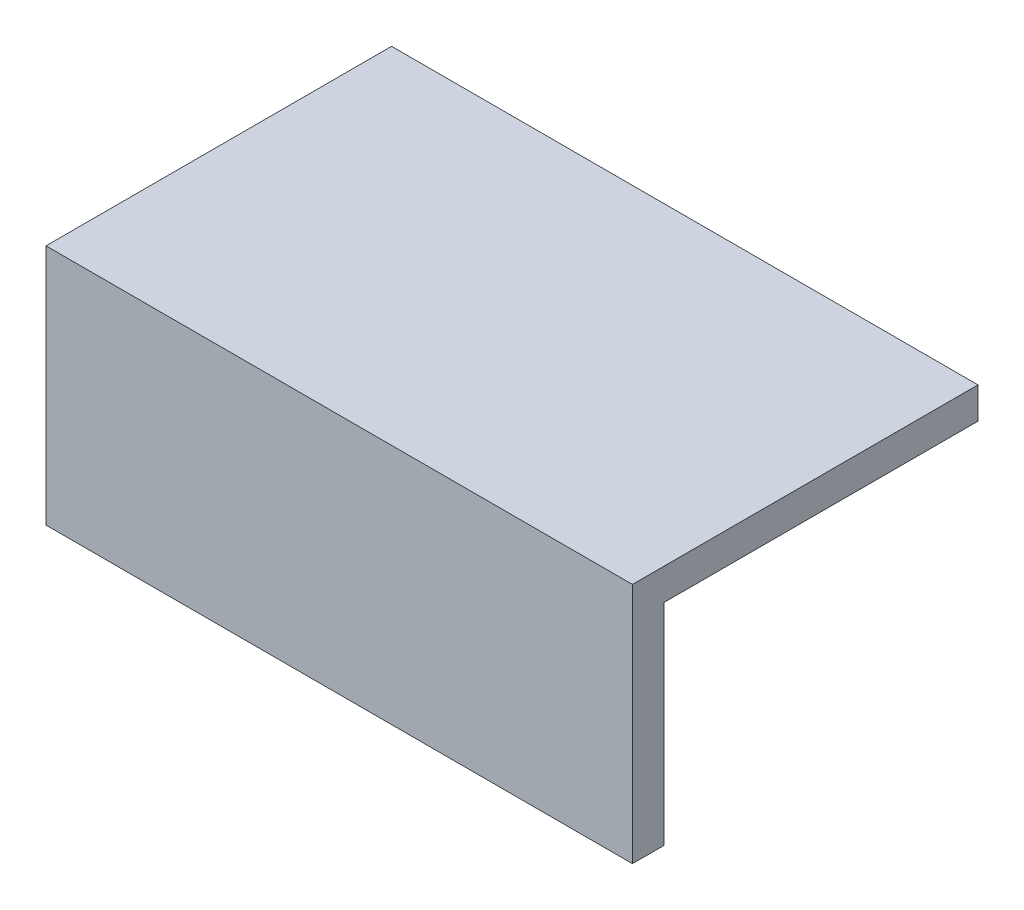
ISO-10303-21;
HEADER;
FILE_DESCRIPTION(('STEP AP214'),'2;1');
FILE_NAME('part.step','',(''),(''),'','','');
FILE_SCHEMA(('AUTOMOTIVE_DESIGN { 1 0 10303 214 1 1 1 1 }'));
ENDSEC;
DATA;
#1=APPLICATION_CONTEXT('core data for automotive mechanical design processes');
#2=APPLICATION_PROTOCOL_DEFINITION('international standard','automotive_design',2000,#1);
#3=PRODUCT_CONTEXT('',#1,'mechanical');
#4=PRODUCT('Part','Part','',(#3));
#5=PRODUCT_RELATED_PRODUCT_CATEGORY('part','',(#4));
#6=PRODUCT_DEFINITION_FORMATION('','',#4);
#7=PRODUCT_DEFINITION_CONTEXT('part definition',#1,'design');
#8=PRODUCT_DEFINITION('design','',#6,#7);
#9=PRODUCT_DEFINITION_SHAPE('','',#8);
#10=(LENGTH_UNIT() NAMED_UNIT(*) SI_UNIT(.MILLI.,.METRE.));
#11=(NAMED_UNIT(*) PLANE_ANGLE_UNIT() SI_UNIT($,.RADIAN.));
#12=(NAMED_UNIT(*) SI_UNIT($,.STERADIAN.) SOLID_ANGLE_UNIT());
#13=UNCERTAINTY_MEASURE_WITH_UNIT(LENGTH_MEASURE(1.E-05),#10,'distance_accuracy_value','');
#14=(GEOMETRIC_REPRESENTATION_CONTEXT(3) GLOBAL_UNCERTAINTY_ASSIGNED_CONTEXT((#13)) GLOBAL_UNIT_ASSIGNED_CONTEXT((#10,
#11,#12)) REPRESENTATION_CONTEXT('',''));
#15=CARTESIAN_POINT('',(0.,0.,0.));
#16=DIRECTION('',(0.,0.,1.));
#17=DIRECTION('',(1.,0.,0.));
#18=AXIS2_PLACEMENT_3D('',#15,#16,#17);
#19=CARTESIAN_POINT('',(-27.2,0.,30.));
#20=DIRECTION('',(-1.,0.,0.));
#21=DIRECTION('',(0.,0.,1.));
#22=AXIS2_PLACEMENT_3D('',#19,#20,#21);
#23=PLANE('',#22);
#24=DIRECTION('',(0.,-1.,0.));
#25=VECTOR('',#24,1.);
#26=CARTESIAN_POINT('',(-27.2,0.,20.));
#27=LINE('',#26,#25);
#28=CARTESIAN_POINT('',(-27.2,31.2967297963401,20.));
#29=VERTEX_POINT('',#28);
#30=CARTESIAN_POINT('',(-27.2,25.,20.));
#31=VERTEX_POINT('',#30);
#32=EDGE_CURVE('E202',#29,#31,#27,.T.);
#33=ORIENTED_EDGE('',*,*,#32,.F.);
#34=DIRECTION('',(0.,0.,-1.));
#35=VECTOR('',#34,1.);
#36=CARTESIAN_POINT('',(-27.2,31.2967297963401,30.));
#37=LINE('',#36,#35);
#38=CARTESIAN_POINT('',(-27.2,31.2967297963401,24.));
#39=VERTEX_POINT('',#38);
#40=EDGE_CURVE('E334',#29,#39,#37,.F.);
#41=ORIENTED_EDGE('',*,*,#40,.T.);
#42=DIRECTION('',(0.,1.,0.));
#43=VECTOR('',#42,1.);
#44=CARTESIAN_POINT('',(-27.2,0.,24.));
#45=LINE('',#44,#43);
#46=CARTESIAN_POINT('',(-27.2,45.09672979634,24.));
#47=VERTEX_POINT('',#46);
#48=EDGE_CURVE('E288',#39,#47,#45,.T.);
#49=ORIENTED_EDGE('',*,*,#48,.T.);
#50=DIRECTION('',(0.,0.,-1.));
#51=VECTOR('',#50,1.);
#52=CARTESIAN_POINT('',(-27.2,45.09672979634,30.));
#53=LINE('',#52,#51);
#54=CARTESIAN_POINT('',(-27.2,45.09672979634,30.));
#55=VERTEX_POINT('',#54);
#56=EDGE_CURVE('E313',#55,#47,#53,.T.);
#57=ORIENTED_EDGE('',*,*,#56,.F.);
#58=DIRECTION('',(0.,1.,0.));
#59=VECTOR('',#58,1.);
#60=CARTESIAN_POINT('',(-27.2,0.,30.));
#61=LINE('',#60,#59);
#62=CARTESIAN_POINT('',(-27.2,25.,30.));
#63=VERTEX_POINT('',#62);
#64=EDGE_CURVE('E295',#63,#55,#61,.T.);
#65=ORIENTED_EDGE('',*,*,#64,.F.);
#66=DIRECTION('',(0.,0.,-1.));
#67=VECTOR('',#66,1.);
#68=CARTESIAN_POINT('',(-27.2,25.,30.));
#69=LINE('',#68,#67);
#70=EDGE_CURVE('E316',#63,#31,#69,.T.);
#71=ORIENTED_EDGE('',*,*,#70,.T.);
#72=EDGE_LOOP('',(#33,#41,#49,#57,#65,#71));
#73=FACE_BOUND('',#72,.T.);
#74=ADVANCED_FACE('F37',(#73),#23,.F.);
#75=CARTESIAN_POINT('',(0.,45.09672979634,30.));
#76=DIRECTION('',(0.,1.,0.));
#77=DIRECTION('',(0.,0.,1.));
#78=AXIS2_PLACEMENT_3D('',#75,#76,#77);
#79=PLANE('',#78);
#80=DIRECTION('',(0.,0.,-1.));
#81=VECTOR('',#80,1.);
#82=CARTESIAN_POINT('',(-4.6329584769427,45.09672979634,30.));
#83=LINE('',#82,#81);
#84=CARTESIAN_POINT('',(-4.6329584769427,45.09672979634,24.));
#85=VERTEX_POINT('',#84);
#86=CARTESIAN_POINT('',(-4.6329584769427,45.09672979634,20.));
#87=VERTEX_POINT('',#86);
#88=EDGE_CURVE('E337',#85,#87,#83,.T.);
#89=ORIENTED_EDGE('',*,*,#88,.T.);
#90=DIRECTION('',(1.,0.,0.));
#91=VECTOR('',#90,1.);
#92=CARTESIAN_POINT('',(0.,45.09672979634,20.));
#93=LINE('',#92,#91);
#94=CARTESIAN_POINT('',(-27.2,45.09672979634,20.));
#95=VERTEX_POINT('',#94);
#96=EDGE_CURVE('E276',#95,#87,#93,.T.);
#97=ORIENTED_EDGE('',*,*,#96,.F.);
#98=CARTESIAN_POINT('',(-27.2,45.09672979634,0.));
#99=VERTEX_POINT('',#98);
#100=EDGE_CURVE('E299',#95,#99,#53,.T.);
#101=ORIENTED_EDGE('',*,*,#100,.T.);
#102=DIRECTION('',(1.,0.,0.));
#103=VECTOR('',#102,1.);
#104=CARTESIAN_POINT('',(0.,45.09672979634,0.));
#105=LINE('',#104,#103);
#106=CARTESIAN_POINT('',(28.,45.09672979634,0.));
#107=VERTEX_POINT('',#106);
#108=EDGE_CURVE('E291',#99,#107,#105,.T.);
#109=ORIENTED_EDGE('',*,*,#108,.T.);
#110=DIRECTION('',(0.,0.,-1.));
#111=VECTOR('',#110,1.);
#112=CARTESIAN_POINT('',(28.,45.09672979634,30.));
#113=LINE('',#112,#111);
#114=CARTESIAN_POINT('',(28.,45.09672979634,30.));
#115=VERTEX_POINT('',#114);
#116=EDGE_CURVE('E324',#115,#107,#113,.T.);
#117=ORIENTED_EDGE('',*,*,#116,.F.);
#118=DIRECTION('',(1.,0.,0.));
#119=VECTOR('',#118,1.);
#120=CARTESIAN_POINT('',(0.,45.09672979634,30.));
#121=LINE('',#120,#119);
#122=EDGE_CURVE('E292',#55,#115,#121,.T.);
#123=ORIENTED_EDGE('',*,*,#122,.F.);
#124=ORIENTED_EDGE('',*,*,#56,.T.);
#125=DIRECTION('',(1.,0.,0.));
#126=VECTOR('',#125,1.);
#127=CARTESIAN_POINT('',(0.,45.09672979634,24.));
#128=LINE('',#127,#126);
#129=EDGE_CURVE('E235',#47,#85,#128,.T.);
#130=ORIENTED_EDGE('',*,*,#129,.T.);
#131=EDGE_LOOP('',(#89,#97,#101,#109,#117,#123,#124,#130));
#132=FACE_BOUND('',#131,.T.);
#133=ADVANCED_FACE('F387',(#132),#79,.F.);
#134=DIRECTION('',(0.,1.,0.));
#135=VECTOR('',#134,1.);
#136=CARTESIAN_POINT('',(-27.2,0.,20.));
#137=LINE('',#136,#135);
#138=CARTESIAN_POINT('',(-27.2,38.0223724406594,20.));
#139=VERTEX_POINT('',#138);
#140=EDGE_CURVE('E278',#139,#95,#137,.T.);
#141=ORIENTED_EDGE('',*,*,#140,.F.);
#142=DIRECTION('',(0.,0.,-1.));
#143=VECTOR('',#142,1.);
#144=CARTESIAN_POINT('',(-27.2,38.0223724406594,33.2068991055148));
#145=LINE('',#144,#143);
#146=CARTESIAN_POINT('',(-27.2,38.0223724406594,0.));
#147=VERTEX_POINT('',#146);
#148=EDGE_CURVE('E205',#139,#147,#145,.T.);
#149=ORIENTED_EDGE('',*,*,#148,.T.);
#150=DIRECTION('',(0.,1.,0.));
#151=VECTOR('',#150,1.);
#152=CARTESIAN_POINT('',(-27.2,0.,0.));
#153=LINE('',#152,#151);
#154=EDGE_CURVE('E296',#147,#99,#153,.T.);
#155=ORIENTED_EDGE('',*,*,#154,.T.);
#156=ORIENTED_EDGE('',*,*,#100,.F.);
#157=EDGE_LOOP('',(#141,#149,#155,#156));
#158=FACE_BOUND('',#157,.T.);
#159=ADVANCED_FACE('F384',(#158),#23,.F.);
#160=CARTESIAN_POINT('',(28.,0.,30.));
#161=DIRECTION('',(-1.,0.,0.));
#162=DIRECTION('',(0.,0.,1.));
#163=AXIS2_PLACEMENT_3D('',#160,#161,#162);
#164=PLANE('',#163);
#165=DIRECTION('',(0.,1.,0.));
#166=VECTOR('',#165,1.);
#167=CARTESIAN_POINT('',(28.,0.,0.));
#168=LINE('',#167,#166);
#169=CARTESIAN_POINT('',(28.,48.0967297963401,0.));
#170=VERTEX_POINT('',#169);
#171=EDGE_CURVE('E302',#107,#170,#168,.T.);
#172=ORIENTED_EDGE('',*,*,#171,.T.);
#173=DIRECTION('',(0.,0.,-1.));
#174=VECTOR('',#173,1.);
#175=CARTESIAN_POINT('',(28.,48.0967297963401,30.));
#176=LINE('',#175,#174);
#177=CARTESIAN_POINT('',(28.,48.0967297963401,33.));
#178=VERTEX_POINT('',#177);
#179=EDGE_CURVE('E322',#178,#170,#176,.T.);
#180=ORIENTED_EDGE('',*,*,#179,.F.);
#181=DIRECTION('',(0.,1.,0.));
#182=VECTOR('',#181,1.);
#183=CARTESIAN_POINT('',(28.,48.0967297963401,33.));
#184=LINE('',#183,#182);
#185=CARTESIAN_POINT('',(28.,25.,33.));
#186=VERTEX_POINT('',#185);
#187=EDGE_CURVE('E223',#186,#178,#184,.T.);
#188=ORIENTED_EDGE('',*,*,#187,.F.);
#189=DIRECTION('',(0.,0.,-1.));
#190=VECTOR('',#189,1.);
#191=CARTESIAN_POINT('',(28.,25.,33.));
#192=LINE('',#191,#190);
#193=CARTESIAN_POINT('',(28.,25.,30.));
#194=VERTEX_POINT('',#193);
#195=EDGE_CURVE('E229',#186,#194,#192,.T.);
#196=ORIENTED_EDGE('',*,*,#195,.T.);
#197=DIRECTION('',(0.,1.,0.));
#198=VECTOR('',#197,1.);
#199=CARTESIAN_POINT('',(28.,48.0967297963401,30.));
#200=LINE('',#199,#198);
#201=EDGE_CURVE('E221',#194,#115,#200,.T.);
#202=ORIENTED_EDGE('',*,*,#201,.T.);
#203=ORIENTED_EDGE('',*,*,#116,.T.);
#204=EDGE_LOOP('',(#172,#180,#188,#196,#202,#203));
#205=FACE_BOUND('',#204,.T.);
#206=ADVANCED_FACE('F390',(#205),#164,.F.);
#207=CARTESIAN_POINT('',(0.,48.0967297963401,30.));
#208=DIRECTION('',(0.,1.,0.));
#209=DIRECTION('',(0.,0.,1.));
#210=AXIS2_PLACEMENT_3D('',#207,#208,#209);
#211=PLANE('',#210);
#212=DIRECTION('',(1.,0.,0.));
#213=VECTOR('',#212,1.);
#214=CARTESIAN_POINT('',(0.,48.0967297963401,0.));
#215=LINE('',#214,#213);
#216=CARTESIAN_POINT('',(-28.,48.0967297963401,0.));
#217=VERTEX_POINT('',#216);
#218=EDGE_CURVE('E305',#217,#170,#215,.T.);
#219=ORIENTED_EDGE('',*,*,#218,.F.);
#220=DIRECTION('',(0.,0.,-1.));
#221=VECTOR('',#220,1.);
#222=CARTESIAN_POINT('',(-28.,48.0967297963401,30.));
#223=LINE('',#222,#221);
#224=CARTESIAN_POINT('',(-28.,48.0967297963401,33.));
#225=VERTEX_POINT('',#224);
#226=EDGE_CURVE('E320',#225,#217,#223,.T.);
#227=ORIENTED_EDGE('',*,*,#226,.F.);
#228=DIRECTION('',(-1.,0.,0.));
#229=VECTOR('',#228,1.);
#230=CARTESIAN_POINT('',(-28.,48.0967297963401,33.));
#231=LINE('',#230,#229);
#232=EDGE_CURVE('E226',#178,#225,#231,.T.);
#233=ORIENTED_EDGE('',*,*,#232,.F.);
#234=ORIENTED_EDGE('',*,*,#179,.T.);
#235=EDGE_LOOP('',(#219,#227,#233,#234));
#236=FACE_BOUND('',#235,.T.);
#237=ADVANCED_FACE('F420',(#236),#211,.T.);
#238=CARTESIAN_POINT('',(-28.,0.,30.));
#239=DIRECTION('',(-1.,0.,0.));
#240=DIRECTION('',(0.,0.,1.));
#241=AXIS2_PLACEMENT_3D('',#238,#239,#240);
#242=PLANE('',#241);
#243=DIRECTION('',(0.,1.,0.));
#244=VECTOR('',#243,1.);
#245=CARTESIAN_POINT('',(-28.,0.,0.));
#246=LINE('',#245,#244);
#247=CARTESIAN_POINT('',(-28.,25.,0.));
#248=VERTEX_POINT('',#247);
#249=EDGE_CURVE('E308',#248,#217,#246,.T.);
#250=ORIENTED_EDGE('',*,*,#249,.F.);
#251=DIRECTION('',(0.,0.,-1.));
#252=VECTOR('',#251,1.);
#253=CARTESIAN_POINT('',(-28.,25.,30.));
#254=LINE('',#253,#252);
#255=CARTESIAN_POINT('',(-28.,25.,33.));
#256=VERTEX_POINT('',#255);
#257=EDGE_CURVE('E318',#256,#248,#254,.T.);
#258=ORIENTED_EDGE('',*,*,#257,.F.);
#259=DIRECTION('',(0.,-1.,0.));
#260=VECTOR('',#259,1.);
#261=CARTESIAN_POINT('',(-28.,48.0967297963401,33.));
#262=LINE('',#261,#260);
#263=EDGE_CURVE('E217',#225,#256,#262,.T.);
#264=ORIENTED_EDGE('',*,*,#263,.F.);
#265=ORIENTED_EDGE('',*,*,#226,.T.);
#266=EDGE_LOOP('',(#250,#258,#264,#265));
#267=FACE_BOUND('',#266,.T.);
#268=ADVANCED_FACE('F425',(#267),#242,.T.);
#269=CARTESIAN_POINT('',(0.,25.,30.));
#270=DIRECTION('',(0.,1.,0.));
#271=DIRECTION('',(0.,0.,1.));
#272=AXIS2_PLACEMENT_3D('',#269,#270,#271);
#273=PLANE('',#272);
#274=DIRECTION('',(1.,0.,0.));
#275=VECTOR('',#274,1.);
#276=CARTESIAN_POINT('',(0.,25.,0.));
#277=LINE('',#276,#275);
#278=CARTESIAN_POINT('',(-25.,25.,0.));
#279=VERTEX_POINT('',#278);
#280=EDGE_CURVE('E209',#248,#279,#277,.T.);
#281=ORIENTED_EDGE('',*,*,#280,.T.);
#282=DIRECTION('',(0.,0.,-1.));
#283=VECTOR('',#282,1.);
#284=CARTESIAN_POINT('',(-25.,25.,33.2068991055148));
#285=LINE('',#284,#283);
#286=CARTESIAN_POINT('',(-25.,25.,20.));
#287=VERTEX_POINT('',#286);
#288=EDGE_CURVE('E191',#287,#279,#285,.T.);
#289=ORIENTED_EDGE('',*,*,#288,.F.);
#290=DIRECTION('',(-1.,0.,0.));
#291=VECTOR('',#290,1.);
#292=CARTESIAN_POINT('',(0.,25.,20.));
#293=LINE('',#292,#291);
#294=EDGE_CURVE('E199',#287,#31,#293,.T.);
#295=ORIENTED_EDGE('',*,*,#294,.T.);
#296=ORIENTED_EDGE('',*,*,#70,.F.);
#297=DIRECTION('',(1.,0.,0.));
#298=VECTOR('',#297,1.);
#299=CARTESIAN_POINT('',(-28.,25.,30.));
#300=LINE('',#299,#298);
#301=EDGE_CURVE('E215',#63,#194,#300,.T.);
#302=ORIENTED_EDGE('',*,*,#301,.T.);
#303=ORIENTED_EDGE('',*,*,#195,.F.);
#304=DIRECTION('',(1.,0.,0.));
#305=VECTOR('',#304,1.);
#306=CARTESIAN_POINT('',(-28.,25.,33.));
#307=LINE('',#306,#305);
#308=EDGE_CURVE('E220',#256,#186,#307,.T.);
#309=ORIENTED_EDGE('',*,*,#308,.F.);
#310=ORIENTED_EDGE('',*,*,#257,.T.);
#311=EDGE_LOOP('',(#281,#289,#295,#296,#302,#303,#309,#310));
#312=FACE_BOUND('',#311,.T.);
#313=ADVANCED_FACE('F207',(#312),#273,.F.);
#314=CARTESIAN_POINT('',(0.,0.,0.));
#315=DIRECTION('',(0.,0.,1.));
#316=DIRECTION('',(1.,0.,0.));
#317=AXIS2_PLACEMENT_3D('',#314,#315,#316);
#318=PLANE('',#317);
#319=ORIENTED_EDGE('',*,*,#108,.F.);
#320=ORIENTED_EDGE('',*,*,#154,.F.);
#321=DIRECTION('',(0.372038204686062,-0.928217417555807,0.));
#322=VECTOR('',#321,1.);
#323=CARTESIAN_POINT('',(-10.3048271121279,-4.13027088900303,0.));
#324=LINE('',#323,#322);
#325=CARTESIAN_POINT('',(-25.,32.5334783085475,0.));
#326=VERTEX_POINT('',#325);
#327=EDGE_CURVE('E363',#147,#326,#324,.T.);
#328=ORIENTED_EDGE('',*,*,#327,.T.);
#329=DIRECTION('',(0.,-1.,0.));
#330=VECTOR('',#329,1.);
#331=CARTESIAN_POINT('',(-25.,0.,0.));
#332=LINE('',#331,#330);
#333=EDGE_CURVE('E196',#326,#279,#332,.T.);
#334=ORIENTED_EDGE('',*,*,#333,.T.);
#335=ORIENTED_EDGE('',*,*,#280,.F.);
#336=ORIENTED_EDGE('',*,*,#249,.T.);
#337=ORIENTED_EDGE('',*,*,#218,.T.);
#338=ORIENTED_EDGE('',*,*,#171,.F.);
#339=EDGE_LOOP('',(#319,#320,#328,#334,#335,#336,#337,#338));
#340=FACE_BOUND('',#339,.T.);
#341=ADVANCED_FACE('F372',(#340),#318,.F.);
#342=CARTESIAN_POINT('',(-28.,35.7967297963401,52.0794194521579));
#343=DIRECTION('',(0.,0.,-1.));
#344=DIRECTION('',(-1.,0.,0.));
#345=AXIS2_PLACEMENT_3D('',#342,#343,#344);
#346=CYLINDRICAL_SURFACE('',#345,6.87401153701774);
#347=CARTESIAN_POINT('',(-28.,35.7967297963401,24.));
#348=DIRECTION('',(0.,0.,1.));
#349=DIRECTION('',(1.,0.,0.));
#350=AXIS2_PLACEMENT_3D('',#347,#348,#349);
#351=CIRCLE('',#350,6.87401153701774);
#352=CARTESIAN_POINT('',(-23.1393398282202,40.6573899681199,24.));
#353=VERTEX_POINT('',#352);
#354=CARTESIAN_POINT('',(-21.2145150145581,34.6970807053136,24.));
#355=VERTEX_POINT('',#354);
#356=EDGE_CURVE('E246',#353,#355,#351,.F.);
#357=ORIENTED_EDGE('',*,*,#356,.F.);
#358=DIRECTION('',(0.,0.,-1.));
#359=VECTOR('',#358,1.);
#360=CARTESIAN_POINT('',(-23.1393398282202,40.6573899681199,52.0794194521579));
#361=LINE('',#360,#359);
#362=CARTESIAN_POINT('',(-23.1393398282202,40.6573899681199,20.));
#363=VERTEX_POINT('',#362);
#364=EDGE_CURVE('E282',#353,#363,#361,.T.);
#365=ORIENTED_EDGE('',*,*,#364,.T.);
#366=CARTESIAN_POINT('',(-28.,35.7967297963401,20.));
#367=DIRECTION('',(0.,0.,1.));
#368=DIRECTION('',(1.,0.,0.));
#369=AXIS2_PLACEMENT_3D('',#366,#367,#368);
#370=CIRCLE('',#369,6.87401153701774);
#371=CARTESIAN_POINT('',(-21.2145150145581,34.6970807053136,20.));
#372=VERTEX_POINT('',#371);
#373=EDGE_CURVE('E268',#363,#372,#370,.F.);
#374=ORIENTED_EDGE('',*,*,#373,.T.);
#375=DIRECTION('',(0.,0.,-1.));
#376=VECTOR('',#375,1.);
#377=CARTESIAN_POINT('',(-21.2145150145581,34.6970807053136,52.0794194521579));
#378=LINE('',#377,#376);
#379=EDGE_CURVE('E280',#355,#372,#378,.T.);
#380=ORIENTED_EDGE('',*,*,#379,.F.);
#381=EDGE_LOOP('',(#357,#365,#374,#380));
#382=FACE_BOUND('',#381,.T.);
#383=ADVANCED_FACE('F459',(#382),#346,.F.);
#384=CARTESIAN_POINT('',(-24.2,39.5967297963401,52.0794194521579));
#385=DIRECTION('',(0.,0.,-1.));
#386=DIRECTION('',(-1.,0.,0.));
#387=AXIS2_PLACEMENT_3D('',#384,#385,#386);
#388=CYLINDRICAL_SURFACE('',#387,1.49999999999999);
#389=ORIENTED_EDGE('',*,*,#364,.F.);
#390=CARTESIAN_POINT('',(-24.2,39.5967297963401,24.));
#391=DIRECTION('',(0.,0.,1.));
#392=DIRECTION('',(1.,0.,0.));
#393=AXIS2_PLACEMENT_3D('',#390,#391,#392);
#394=CIRCLE('',#393,1.49999999999999);
#395=CARTESIAN_POINT('',(-25.2606601717798,38.5360696245602,24.));
#396=VERTEX_POINT('',#395);
#397=EDGE_CURVE('E249',#353,#396,#394,.T.);
#398=ORIENTED_EDGE('',*,*,#397,.T.);
#399=DIRECTION('',(0.,0.,-1.));
#400=VECTOR('',#399,1.);
#401=CARTESIAN_POINT('',(-25.2606601717798,38.5360696245602,52.0794194521579));
#402=LINE('',#401,#400);
#403=CARTESIAN_POINT('',(-25.2606601717798,38.5360696245602,20.));
#404=VERTEX_POINT('',#403);
#405=EDGE_CURVE('E284',#396,#404,#402,.T.);
#406=ORIENTED_EDGE('',*,*,#405,.T.);
#407=CARTESIAN_POINT('',(-24.2,39.5967297963401,20.));
#408=DIRECTION('',(0.,0.,1.));
#409=DIRECTION('',(1.,0.,0.));
#410=AXIS2_PLACEMENT_3D('',#407,#408,#409);
#411=CIRCLE('',#410,1.49999999999999);
#412=EDGE_CURVE('E265',#363,#404,#411,.T.);
#413=ORIENTED_EDGE('',*,*,#412,.F.);
#414=EDGE_LOOP('',(#389,#398,#406,#413));
#415=FACE_BOUND('',#414,.T.);
#416=ADVANCED_FACE('F462',(#415),#388,.F.);
#417=CARTESIAN_POINT('',(-28.,35.7967297963401,52.0794194521579));
#418=DIRECTION('',(0.,0.,-1.));
#419=DIRECTION('',(-1.,0.,0.));
#420=AXIS2_PLACEMENT_3D('',#417,#418,#419);
#421=CYLINDRICAL_SURFACE('',#420,3.87401153701774);
#422=ORIENTED_EDGE('',*,*,#405,.F.);
#423=CARTESIAN_POINT('',(-28.,35.7967297963401,24.));
#424=DIRECTION('',(0.,0.,1.));
#425=DIRECTION('',(1.,0.,0.));
#426=AXIS2_PLACEMENT_3D('',#423,#424,#425);
#427=CIRCLE('',#426,3.87401153701774);
#428=CARTESIAN_POINT('',(-24.1758796917488,35.1769965819911,24.));
#429=VERTEX_POINT('',#428);
#430=EDGE_CURVE('E251',#396,#429,#427,.F.);
#431=ORIENTED_EDGE('',*,*,#430,.T.);
#432=DIRECTION('',(0.,0.,-1.));
#433=VECTOR('',#432,1.);
#434=CARTESIAN_POINT('',(-24.1758796917488,35.1769965819911,52.0794194521579));
#435=LINE('',#434,#433);
#436=CARTESIAN_POINT('',(-24.1758796917488,35.1769965819911,20.));
#437=VERTEX_POINT('',#436);
#438=EDGE_CURVE('E286',#429,#437,#435,.T.);
#439=ORIENTED_EDGE('',*,*,#438,.T.);
#440=CARTESIAN_POINT('',(-28.,35.7967297963401,20.));
#441=DIRECTION('',(0.,0.,1.));
#442=DIRECTION('',(1.,0.,0.));
#443=AXIS2_PLACEMENT_3D('',#440,#441,#442);
#444=CIRCLE('',#443,3.87401153701774);
#445=EDGE_CURVE('E262',#404,#437,#444,.F.);
#446=ORIENTED_EDGE('',*,*,#445,.F.);
#447=EDGE_LOOP('',(#422,#431,#439,#446));
#448=FACE_BOUND('',#447,.T.);
#449=ADVANCED_FACE('F466',(#448),#421,.T.);
#450=CARTESIAN_POINT('',(-22.6951973531534,34.9370386436524,52.0794194521579));
#451=DIRECTION('',(0.,0.,-1.));
#452=DIRECTION('',(-1.,0.,0.));
#453=AXIS2_PLACEMENT_3D('',#450,#451,#452);
#454=CYLINDRICAL_SURFACE('',#453,1.5);
#455=ORIENTED_EDGE('',*,*,#438,.F.);
#456=CARTESIAN_POINT('',(-22.6951973531534,34.9370386436524,24.));
#457=DIRECTION('',(0.,0.,1.));
#458=DIRECTION('',(1.,0.,0.));
#459=AXIS2_PLACEMENT_3D('',#456,#457,#458);
#460=CIRCLE('',#459,1.5);
#461=EDGE_CURVE('E253',#429,#355,#460,.T.);
#462=ORIENTED_EDGE('',*,*,#461,.T.);
#463=ORIENTED_EDGE('',*,*,#379,.T.);
#464=CARTESIAN_POINT('',(-22.6951973531534,34.9370386436524,20.));
#465=DIRECTION('',(0.,0.,1.));
#466=DIRECTION('',(1.,0.,0.));
#467=AXIS2_PLACEMENT_3D('',#464,#465,#466);
#468=CIRCLE('',#467,1.5);
#469=EDGE_CURVE('E259',#437,#372,#468,.T.);
#470=ORIENTED_EDGE('',*,*,#469,.F.);
#471=EDGE_LOOP('',(#455,#462,#463,#470));
#472=FACE_BOUND('',#471,.T.);
#473=ADVANCED_FACE('F470',(#472),#454,.F.);
#474=CARTESIAN_POINT('',(-9.13295847694271,35.7967297963401,52.0794194521579));
#475=DIRECTION('',(0.,0.,-1.));
#476=DIRECTION('',(-1.,0.,0.));
#477=AXIS2_PLACEMENT_3D('',#474,#475,#476);
#478=CYLINDRICAL_SURFACE('',#477,1.5);
#479=CARTESIAN_POINT('',(-9.13295847694271,35.7967297963401,20.));
#480=DIRECTION('',(0.,0.,1.));
#481=DIRECTION('',(1.,0.,0.));
#482=AXIS2_PLACEMENT_3D('',#479,#480,#481);
#483=CIRCLE('',#482,1.5);
#484=CARTESIAN_POINT('',(-7.63295847694271,35.7967297963401,20.));
#485=VERTEX_POINT('',#484);
#486=EDGE_CURVE('E256',#485,#485,#483,.T.);
#487=ORIENTED_EDGE('',*,*,#486,.F.);
#488=EDGE_LOOP('',(#487));
#489=FACE_BOUND('',#488,.T.);
#490=CARTESIAN_POINT('',(-9.13295847694271,35.7967297963401,24.));
#491=DIRECTION('',(0.,0.,1.));
#492=DIRECTION('',(1.,0.,0.));
#493=AXIS2_PLACEMENT_3D('',#490,#491,#492);
#494=CIRCLE('',#493,1.5);
#495=CARTESIAN_POINT('',(-7.63295847694271,35.7967297963401,24.));
#496=VERTEX_POINT('',#495);
#497=EDGE_CURVE('E243',#496,#496,#494,.T.);
#498=ORIENTED_EDGE('',*,*,#497,.T.);
#499=EDGE_LOOP('',(#498));
#500=FACE_BOUND('',#499,.T.);
#501=ADVANCED_FACE('F453',(#489,#500),#478,.F.);
#502=CARTESIAN_POINT('',(0.,0.,20.));
#503=DIRECTION('',(0.,0.,1.));
#504=DIRECTION('',(1.,0.,0.));
#505=AXIS2_PLACEMENT_3D('',#502,#503,#504);
#506=PLANE('',#505);
#507=ORIENTED_EDGE('',*,*,#486,.T.);
#508=EDGE_LOOP('',(#507));
#509=FACE_BOUND('',#508,.T.);
#510=ORIENTED_EDGE('',*,*,#469,.T.);
#511=ORIENTED_EDGE('',*,*,#373,.F.);
#512=ORIENTED_EDGE('',*,*,#412,.T.);
#513=ORIENTED_EDGE('',*,*,#445,.T.);
#514=EDGE_LOOP('',(#510,#511,#512,#513));
#515=FACE_BOUND('',#514,.T.);
#516=DIRECTION('',(0.,-1.,0.));
#517=VECTOR('',#516,1.);
#518=CARTESIAN_POINT('',(-5.6329584769427,0.,20.));
#519=LINE('',#518,#517);
#520=CARTESIAN_POINT('',(-5.6329584769427,44.09672979634,20.));
#521=VERTEX_POINT('',#520);
#522=CARTESIAN_POINT('',(-5.6329584769427,33.2967297963401,20.));
#523=VERTEX_POINT('',#522);
#524=EDGE_CURVE('E274',#521,#523,#519,.T.);
#525=ORIENTED_EDGE('',*,*,#524,.T.);
#526=CARTESIAN_POINT('',(-6.6329584769427,33.2967297963401,20.));
#527=DIRECTION('',(0.,0.,1.));
#528=DIRECTION('',(1.,0.,0.));
#529=AXIS2_PLACEMENT_3D('',#526,#527,#528);
#530=CIRCLE('',#529,1.);
#531=CARTESIAN_POINT('',(-6.6329584769427,32.2967297963401,20.));
#532=VERTEX_POINT('',#531);
#533=EDGE_CURVE('E52',#523,#532,#530,.F.);
#534=ORIENTED_EDGE('',*,*,#533,.T.);
#535=DIRECTION('',(-1.,0.,0.));
#536=VECTOR('',#535,1.);
#537=CARTESIAN_POINT('',(0.,32.2967297963401,20.));
#538=LINE('',#537,#536);
#539=CARTESIAN_POINT('',(-25.,32.2967297963401,20.));
#540=VERTEX_POINT('',#539);
#541=EDGE_CURVE('E272',#532,#540,#538,.T.);
#542=ORIENTED_EDGE('',*,*,#541,.T.);
#543=DIRECTION('',(0.,-1.,0.));
#544=VECTOR('',#543,1.);
#545=CARTESIAN_POINT('',(-25.,0.,20.));
#546=LINE('',#545,#544);
#547=CARTESIAN_POINT('',(-25.,32.5334783085475,20.));
#548=VERTEX_POINT('',#547);
#549=EDGE_CURVE('E193',#548,#540,#546,.T.);
#550=ORIENTED_EDGE('',*,*,#549,.F.);
#551=DIRECTION('',(0.372038204686062,-0.928217417555807,0.));
#552=VECTOR('',#551,1.);
#553=CARTESIAN_POINT('',(-10.3048271121279,-4.13027088900303,20.));
#554=LINE('',#553,#552);
#555=EDGE_CURVE('E216',#139,#548,#554,.T.);
#556=ORIENTED_EDGE('',*,*,#555,.F.);
#557=ORIENTED_EDGE('',*,*,#140,.T.);
#558=ORIENTED_EDGE('',*,*,#96,.T.);
#559=CARTESIAN_POINT('',(-4.6329584769427,44.09672979634,20.));
#560=DIRECTION('',(0.,0.,1.));
#561=DIRECTION('',(1.,0.,0.));
#562=AXIS2_PLACEMENT_3D('',#559,#560,#561);
#563=CIRCLE('',#562,1.);
#564=EDGE_CURVE('E45',#87,#521,#563,.T.);
#565=ORIENTED_EDGE('',*,*,#564,.T.);
#566=EDGE_LOOP('',(#525,#534,#542,#550,#556,#557,#558,#565));
#567=FACE_BOUND('',#566,.T.);
#568=ADVANCED_FACE('F380',(#509,#515,#567),#506,.F.);
#569=CARTESIAN_POINT('',(-5.6329584769427,0.,52.0794194521579));
#570=DIRECTION('',(1.,0.,0.));
#571=DIRECTION('',(0.,1.,0.));
#572=AXIS2_PLACEMENT_3D('',#569,#570,#571);
#573=PLANE('',#572);
#574=ORIENTED_EDGE('',*,*,#524,.F.);
#575=DIRECTION('',(0.,0.,-1.));
#576=VECTOR('',#575,1.);
#577=CARTESIAN_POINT('',(-5.6329584769427,44.09672979634,52.0794194521579));
#578=LINE('',#577,#576);
#579=CARTESIAN_POINT('',(-5.6329584769427,44.09672979634,24.));
#580=VERTEX_POINT('',#579);
#581=EDGE_CURVE('E342',#521,#580,#578,.F.);
#582=ORIENTED_EDGE('',*,*,#581,.T.);
#583=DIRECTION('',(0.,-1.,0.));
#584=VECTOR('',#583,1.);
#585=CARTESIAN_POINT('',(-5.6329584769427,0.,24.));
#586=LINE('',#585,#584);
#587=CARTESIAN_POINT('',(-5.6329584769427,33.2967297963401,24.));
#588=VERTEX_POINT('',#587);
#589=EDGE_CURVE('E237',#580,#588,#586,.T.);
#590=ORIENTED_EDGE('',*,*,#589,.T.);
#591=DIRECTION('',(0.,0.,-1.));
#592=VECTOR('',#591,1.);
#593=CARTESIAN_POINT('',(-5.6329584769427,33.2967297963401,52.0794194521579));
#594=LINE('',#593,#592);
#595=EDGE_CURVE('E340',#588,#523,#594,.T.);
#596=ORIENTED_EDGE('',*,*,#595,.T.);
#597=EDGE_LOOP('',(#574,#582,#590,#596));
#598=FACE_BOUND('',#597,.T.);
#599=ADVANCED_FACE('F403',(#598),#573,.T.);
#600=CARTESIAN_POINT('',(0.,32.2967297963401,52.0794194521579));
#601=DIRECTION('',(0.,-1.,0.));
#602=DIRECTION('',(0.,0.,-1.));
#603=AXIS2_PLACEMENT_3D('',#600,#601,#602);
#604=PLANE('',#603);
#605=DIRECTION('',(-1.,0.,0.));
#606=VECTOR('',#605,1.);
#607=CARTESIAN_POINT('',(0.,32.2967297963401,24.));
#608=LINE('',#607,#606);
#609=CARTESIAN_POINT('',(-6.6329584769427,32.2967297963401,24.));
#610=VERTEX_POINT('',#609);
#611=CARTESIAN_POINT('',(-26.2,32.2967297963401,24.));
#612=VERTEX_POINT('',#611);
#613=EDGE_CURVE('E240',#610,#612,#608,.T.);
#614=ORIENTED_EDGE('',*,*,#613,.T.);
#615=DIRECTION('',(0.,0.,-1.));
#616=VECTOR('',#615,1.);
#617=CARTESIAN_POINT('',(-26.2,32.2967297963401,52.0794194521579));
#618=LINE('',#617,#616);
#619=CARTESIAN_POINT('',(-26.2,32.2967297963401,20.));
#620=VERTEX_POINT('',#619);
#621=EDGE_CURVE('E329',#612,#620,#618,.T.);
#622=ORIENTED_EDGE('',*,*,#621,.T.);
#623=EDGE_CURVE('E271',#540,#620,#538,.T.);
#624=ORIENTED_EDGE('',*,*,#623,.F.);
#625=ORIENTED_EDGE('',*,*,#541,.F.);
#626=DIRECTION('',(0.,0.,-1.));
#627=VECTOR('',#626,1.);
#628=CARTESIAN_POINT('',(-6.6329584769427,32.2967297963401,52.0794194521579));
#629=LINE('',#628,#627);
#630=EDGE_CURVE('E327',#532,#610,#629,.F.);
#631=ORIENTED_EDGE('',*,*,#630,.T.);
#632=EDGE_LOOP('',(#614,#622,#624,#625,#631));
#633=FACE_BOUND('',#632,.T.);
#634=ADVANCED_FACE('F357',(#633),#604,.T.);
#635=CARTESIAN_POINT('',(-28.,19.,24.));
#636=DIRECTION('',(0.,0.,1.));
#637=DIRECTION('',(1.,0.,0.));
#638=AXIS2_PLACEMENT_3D('',#635,#636,#637);
#639=PLANE('',#638);
#640=ORIENTED_EDGE('',*,*,#461,.F.);
#641=ORIENTED_EDGE('',*,*,#430,.F.);
#642=ORIENTED_EDGE('',*,*,#397,.F.);
#643=ORIENTED_EDGE('',*,*,#356,.T.);
#644=EDGE_LOOP('',(#640,#641,#642,#643));
#645=FACE_BOUND('',#644,.T.);
#646=ORIENTED_EDGE('',*,*,#497,.F.);
#647=EDGE_LOOP('',(#646));
#648=FACE_BOUND('',#647,.T.);
#649=ORIENTED_EDGE('',*,*,#613,.F.);
#650=CARTESIAN_POINT('',(-6.6329584769427,33.2967297963401,24.));
#651=DIRECTION('',(0.,0.,1.));
#652=DIRECTION('',(1.,0.,0.));
#653=AXIS2_PLACEMENT_3D('',#650,#651,#652);
#654=CIRCLE('',#653,1.);
#655=EDGE_CURVE('E345',#610,#588,#654,.T.);
#656=ORIENTED_EDGE('',*,*,#655,.T.);
#657=ORIENTED_EDGE('',*,*,#589,.F.);
#658=CARTESIAN_POINT('',(-4.6329584769427,44.09672979634,24.));
#659=DIRECTION('',(0.,0.,1.));
#660=DIRECTION('',(1.,0.,0.));
#661=AXIS2_PLACEMENT_3D('',#658,#659,#660);
#662=CIRCLE('',#661,1.);
#663=EDGE_CURVE('E11',#580,#85,#662,.F.);
#664=ORIENTED_EDGE('',*,*,#663,.T.);
#665=ORIENTED_EDGE('',*,*,#129,.F.);
#666=ORIENTED_EDGE('',*,*,#48,.F.);
#667=CARTESIAN_POINT('',(-26.2,31.2967297963401,24.));
#668=DIRECTION('',(0.,0.,1.));
#669=DIRECTION('',(1.,0.,0.));
#670=AXIS2_PLACEMENT_3D('',#667,#668,#669);
#671=CIRCLE('',#670,1.);
#672=EDGE_CURVE('E347',#39,#612,#671,.F.);
#673=ORIENTED_EDGE('',*,*,#672,.T.);
#674=EDGE_LOOP('',(#649,#656,#657,#664,#665,#666,#673));
#675=FACE_BOUND('',#674,.T.);
#676=ADVANCED_FACE('F351',(#645,#648,#675),#639,.T.);
#677=CARTESIAN_POINT('',(0.,0.,30.));
#678=DIRECTION('',(0.,0.,1.));
#679=DIRECTION('',(1.,0.,0.));
#680=AXIS2_PLACEMENT_3D('',#677,#678,#679);
#681=PLANE('',#680);
#682=ORIENTED_EDGE('',*,*,#64,.T.);
#683=ORIENTED_EDGE('',*,*,#122,.T.);
#684=ORIENTED_EDGE('',*,*,#201,.F.);
#685=ORIENTED_EDGE('',*,*,#301,.F.);
#686=EDGE_LOOP('',(#682,#683,#684,#685));
#687=FACE_BOUND('',#686,.T.);
#688=ADVANCED_FACE('F394',(#687),#681,.F.);
#689=CARTESIAN_POINT('',(0.,0.,33.));
#690=DIRECTION('',(0.,0.,1.));
#691=DIRECTION('',(1.,0.,0.));
#692=AXIS2_PLACEMENT_3D('',#689,#690,#691);
#693=PLANE('',#692);
#694=ORIENTED_EDGE('',*,*,#263,.T.);
#695=ORIENTED_EDGE('',*,*,#308,.T.);
#696=ORIENTED_EDGE('',*,*,#187,.T.);
#697=ORIENTED_EDGE('',*,*,#232,.T.);
#698=EDGE_LOOP('',(#694,#695,#696,#697));
#699=FACE_BOUND('',#698,.T.);
#700=ADVANCED_FACE('F442',(#699),#693,.T.);
#701=CARTESIAN_POINT('',(0.,0.,20.));
#702=DIRECTION('',(0.,0.,1.));
#703=DIRECTION('',(1.,0.,0.));
#704=AXIS2_PLACEMENT_3D('',#701,#702,#703);
#705=PLANE('',#704);
#706=ORIENTED_EDGE('',*,*,#623,.T.);
#707=CARTESIAN_POINT('',(-26.2,31.2967297963401,20.));
#708=DIRECTION('',(0.,0.,1.));
#709=DIRECTION('',(1.,0.,0.));
#710=AXIS2_PLACEMENT_3D('',#707,#708,#709);
#711=CIRCLE('',#710,1.);
#712=EDGE_CURVE('E332',#620,#29,#711,.T.);
#713=ORIENTED_EDGE('',*,*,#712,.T.);
#714=ORIENTED_EDGE('',*,*,#32,.T.);
#715=ORIENTED_EDGE('',*,*,#294,.F.);
#716=EDGE_CURVE('E185',#540,#287,#546,.T.);
#717=ORIENTED_EDGE('',*,*,#716,.F.);
#718=EDGE_LOOP('',(#706,#713,#714,#715,#717));
#719=FACE_BOUND('',#718,.T.);
#720=ADVANCED_FACE('F200',(#719),#705,.T.);
#721=CARTESIAN_POINT('',(-25.,0.,33.2068991055148));
#722=DIRECTION('',(1.,0.,0.));
#723=DIRECTION('',(0.,1.,0.));
#724=AXIS2_PLACEMENT_3D('',#721,#722,#723);
#725=PLANE('',#724);
#726=DIRECTION('',(0.,0.,-1.));
#727=VECTOR('',#726,1.);
#728=CARTESIAN_POINT('',(-25.,32.5334783085475,33.2068991055148));
#729=LINE('',#728,#727);
#730=EDGE_CURVE('E213',#548,#326,#729,.T.);
#731=ORIENTED_EDGE('',*,*,#730,.F.);
#732=ORIENTED_EDGE('',*,*,#549,.T.);
#733=ORIENTED_EDGE('',*,*,#716,.T.);
#734=ORIENTED_EDGE('',*,*,#288,.T.);
#735=ORIENTED_EDGE('',*,*,#333,.F.);
#736=EDGE_LOOP('',(#731,#732,#733,#734,#735));
#737=FACE_BOUND('',#736,.T.);
#738=ADVANCED_FACE('F188',(#737),#725,.T.);
#739=CARTESIAN_POINT('',(-10.3048271121279,-4.13027088900303,33.2068991055148));
#740=DIRECTION('',(0.928217417555807,0.372038204686062,0.));
#741=DIRECTION('',(-0.372038204686062,0.928217417555807,0.));
#742=AXIS2_PLACEMENT_3D('',#739,#740,#741);
#743=PLANE('',#742);
#744=ORIENTED_EDGE('',*,*,#148,.F.);
#745=ORIENTED_EDGE('',*,*,#555,.T.);
#746=ORIENTED_EDGE('',*,*,#730,.T.);
#747=ORIENTED_EDGE('',*,*,#327,.F.);
#748=EDGE_LOOP('',(#744,#745,#746,#747));
#749=FACE_BOUND('',#748,.T.);
#750=ADVANCED_FACE('F378',(#749),#743,.T.);
#751=CARTESIAN_POINT('',(-26.2,31.2967297963401,52.0794194521579));
#752=DIRECTION('',(0.,0.,-1.));
#753=DIRECTION('',(-1.,0.,0.));
#754=AXIS2_PLACEMENT_3D('',#751,#752,#753);
#755=CYLINDRICAL_SURFACE('',#754,1.);
#756=ORIENTED_EDGE('',*,*,#672,.F.);
#757=ORIENTED_EDGE('',*,*,#40,.F.);
#758=ORIENTED_EDGE('',*,*,#712,.F.);
#759=ORIENTED_EDGE('',*,*,#621,.F.);
#760=EDGE_LOOP('',(#756,#757,#758,#759));
#761=FACE_BOUND('',#760,.T.);
#762=ADVANCED_FACE('F360',(#761),#755,.F.);
#763=CARTESIAN_POINT('',(-4.6329584769427,44.09672979634,30.));
#764=DIRECTION('',(0.,0.,-1.));
#765=DIRECTION('',(-1.,0.,0.));
#766=AXIS2_PLACEMENT_3D('',#763,#764,#765);
#767=CYLINDRICAL_SURFACE('',#766,1.);
#768=ORIENTED_EDGE('',*,*,#663,.F.);
#769=ORIENTED_EDGE('',*,*,#581,.F.);
#770=ORIENTED_EDGE('',*,*,#564,.F.);
#771=ORIENTED_EDGE('',*,*,#88,.F.);
#772=EDGE_LOOP('',(#768,#769,#770,#771));
#773=FACE_BOUND('',#772,.T.);
#774=ADVANCED_FACE('F401',(#773),#767,.F.);
#775=CARTESIAN_POINT('',(-6.6329584769427,33.2967297963401,52.0794194521579));
#776=DIRECTION('',(0.,0.,-1.));
#777=DIRECTION('',(-1.,0.,0.));
#778=AXIS2_PLACEMENT_3D('',#775,#776,#777);
#779=CYLINDRICAL_SURFACE('',#778,1.);
#780=ORIENTED_EDGE('',*,*,#655,.F.);
#781=ORIENTED_EDGE('',*,*,#630,.F.);
#782=ORIENTED_EDGE('',*,*,#533,.F.);
#783=ORIENTED_EDGE('',*,*,#595,.F.);
#784=EDGE_LOOP('',(#780,#781,#782,#783));
#785=FACE_BOUND('',#784,.T.);
#786=ADVANCED_FACE('F39',(#785),#779,.T.);
#787=CLOSED_SHELL('',(#74,#133,#159,#206,#237,#268,#313,#341,#383,#416,#449,#473,#501,#568,#599,
#634,#676,#688,#700,#720,#738,#750,#762,#774,#786));
#788=MANIFOLD_SOLID_BREP('B2',#787);
#789=ADVANCED_BREP_SHAPE_REPRESENTATION('',(#18,#788),#14);
#790=SHAPE_DEFINITION_REPRESENTATION(#9,#789);
ENDSEC;
END-ISO-10303-21;
